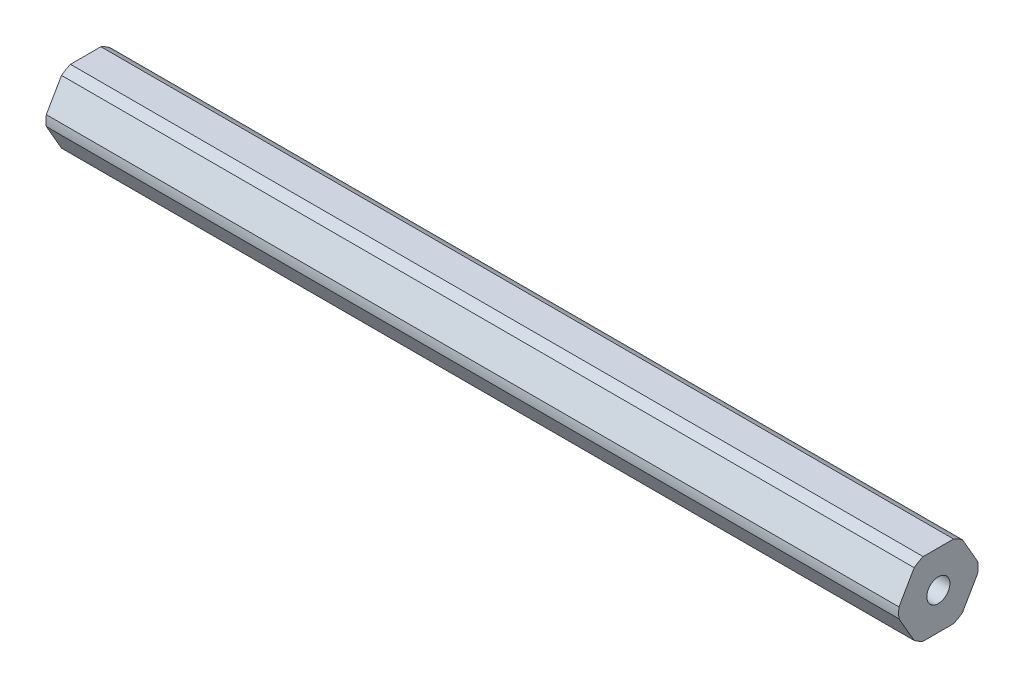
ISO-10303-21;
HEADER;
FILE_DESCRIPTION(('STEP AP214'),'2;1');
FILE_NAME('part.step','',(''),(''),'','','');
FILE_SCHEMA(('AUTOMOTIVE_DESIGN { 1 0 10303 214 1 1 1 1 }'));
ENDSEC;
DATA;
#1=APPLICATION_CONTEXT('core data for automotive mechanical design processes');
#2=APPLICATION_PROTOCOL_DEFINITION('international standard','automotive_design',2000,#1);
#3=PRODUCT_CONTEXT('',#1,'mechanical');
#4=PRODUCT('Part','Part','',(#3));
#5=PRODUCT_RELATED_PRODUCT_CATEGORY('part','',(#4));
#6=PRODUCT_DEFINITION_FORMATION('','',#4);
#7=PRODUCT_DEFINITION_CONTEXT('part definition',#1,'design');
#8=PRODUCT_DEFINITION('design','',#6,#7);
#9=PRODUCT_DEFINITION_SHAPE('','',#8);
#10=(LENGTH_UNIT() NAMED_UNIT(*) SI_UNIT(.MILLI.,.METRE.));
#11=(NAMED_UNIT(*) PLANE_ANGLE_UNIT() SI_UNIT($,.RADIAN.));
#12=(NAMED_UNIT(*) SI_UNIT($,.STERADIAN.) SOLID_ANGLE_UNIT());
#13=UNCERTAINTY_MEASURE_WITH_UNIT(LENGTH_MEASURE(1.E-05),#10,'distance_accuracy_value','');
#14=(GEOMETRIC_REPRESENTATION_CONTEXT(3) GLOBAL_UNCERTAINTY_ASSIGNED_CONTEXT((#13)) GLOBAL_UNIT_ASSIGNED_CONTEXT((#10,
#11,#12)) REPRESENTATION_CONTEXT('',''));
#15=CARTESIAN_POINT('',(0.,0.,0.));
#16=DIRECTION('',(0.,0.,1.));
#17=DIRECTION('',(1.,0.,0.));
#18=AXIS2_PLACEMENT_3D('',#15,#16,#17);
#19=CARTESIAN_POINT('',(73.81875,3.17499999999999,-5.49926131403116));
#20=DIRECTION('',(0.,-0.500000000000001,0.866025403784438));
#21=DIRECTION('',(0.,-0.866025403784438,-0.500000000000001));
#22=AXIS2_PLACEMENT_3D('',#19,#20,#21);
#23=PLANE('',#22);
#24=DIRECTION('',(0.,0.866025403784438,0.500000000000001));
#25=VECTOR('',#24,1.);
#26=CARTESIAN_POINT('',(-73.81875,3.17499999999999,-5.49926131403116));
#27=LINE('',#26,#25);
#28=CARTESIAN_POINT('',(-73.81875,0.89303957103212,-6.81675178197584));
#29=VERTEX_POINT('',#28);
#30=CARTESIAN_POINT('',(-73.81875,5.45696042896787,-4.18177084608648));
#31=VERTEX_POINT('',#30);
#32=EDGE_CURVE('E164',#29,#31,#27,.T.);
#33=ORIENTED_EDGE('',*,*,#32,.T.);
#34=DIRECTION('',(-1.,0.,0.));
#35=VECTOR('',#34,1.);
#36=CARTESIAN_POINT('',(73.81875,5.45696042896787,-4.18177084608648));
#37=LINE('',#36,#35);
#38=CARTESIAN_POINT('',(73.81875,5.45696042896787,-4.18177084608648));
#39=VERTEX_POINT('',#38);
#40=EDGE_CURVE('E11',#39,#31,#37,.T.);
#41=ORIENTED_EDGE('',*,*,#40,.F.);
#42=DIRECTION('',(0.,0.866025403784438,0.500000000000001));
#43=VECTOR('',#42,1.);
#44=CARTESIAN_POINT('',(73.81875,3.17499999999999,-5.49926131403116));
#45=LINE('',#44,#43);
#46=CARTESIAN_POINT('',(73.81875,0.89303957103212,-6.81675178197584));
#47=VERTEX_POINT('',#46);
#48=EDGE_CURVE('E223',#47,#39,#45,.T.);
#49=ORIENTED_EDGE('',*,*,#48,.F.);
#50=DIRECTION('',(-1.,0.,0.));
#51=VECTOR('',#50,1.);
#52=CARTESIAN_POINT('',(73.81875,0.89303957103212,-6.81675178197584));
#53=LINE('',#52,#51);
#54=EDGE_CURVE('E157',#47,#29,#53,.T.);
#55=ORIENTED_EDGE('',*,*,#54,.T.);
#56=EDGE_LOOP('',(#33,#41,#49,#55));
#57=FACE_BOUND('',#56,.T.);
#58=ADVANCED_FACE('F39',(#57),#23,.F.);
#59=CARTESIAN_POINT('',(73.81875,0.,0.));
#60=DIRECTION('',(-1.,0.,0.));
#61=DIRECTION('',(0.,0.,1.));
#62=AXIS2_PLACEMENT_3D('',#59,#60,#61);
#63=CYLINDRICAL_SURFACE('',#62,6.874999966);
#64=CARTESIAN_POINT('',(-73.81875,0.,0.));
#65=DIRECTION('',(1.,0.,0.));
#66=DIRECTION('',(0.,0.,-1.));
#67=AXIS2_PLACEMENT_3D('',#64,#65,#66);
#68=CIRCLE('',#67,6.874999966);
#69=CARTESIAN_POINT('',(-73.81875,6.34999999999998,-2.63498093588933));
#70=VERTEX_POINT('',#69);
#71=EDGE_CURVE('E167',#31,#70,#68,.T.);
#72=ORIENTED_EDGE('',*,*,#71,.T.);
#73=DIRECTION('',(-1.,0.,0.));
#74=VECTOR('',#73,1.);
#75=CARTESIAN_POINT('',(73.81875,6.34999999999998,-2.63498093588933));
#76=LINE('',#75,#74);
#77=CARTESIAN_POINT('',(73.81875,6.34999999999998,-2.63498093588933));
#78=VERTEX_POINT('',#77);
#79=EDGE_CURVE('E48',#78,#70,#76,.T.);
#80=ORIENTED_EDGE('',*,*,#79,.F.);
#81=CARTESIAN_POINT('',(73.81875,0.,0.));
#82=DIRECTION('',(1.,0.,0.));
#83=DIRECTION('',(0.,0.,-1.));
#84=AXIS2_PLACEMENT_3D('',#81,#82,#83);
#85=CIRCLE('',#84,6.874999966);
#86=EDGE_CURVE('E111',#39,#78,#85,.T.);
#87=ORIENTED_EDGE('',*,*,#86,.F.);
#88=ORIENTED_EDGE('',*,*,#40,.T.);
#89=EDGE_LOOP('',(#72,#80,#87,#88));
#90=FACE_BOUND('',#89,.T.);
#91=ADVANCED_FACE('F258',(#90),#63,.T.);
#92=CARTESIAN_POINT('',(73.81875,6.34999999999997,0.));
#93=DIRECTION('',(0.,-1.,0.));
#94=DIRECTION('',(0.,0.,-1.));
#95=AXIS2_PLACEMENT_3D('',#92,#93,#94);
#96=PLANE('',#95);
#97=DIRECTION('',(0.,0.,1.));
#98=VECTOR('',#97,1.);
#99=CARTESIAN_POINT('',(-73.81875,6.34999999999997,0.));
#100=LINE('',#99,#98);
#101=CARTESIAN_POINT('',(-73.81875,6.34999999999997,2.63498093588938));
#102=VERTEX_POINT('',#101);
#103=EDGE_CURVE('E169',#70,#102,#100,.T.);
#104=ORIENTED_EDGE('',*,*,#103,.T.);
#105=DIRECTION('',(-1.,0.,0.));
#106=VECTOR('',#105,1.);
#107=CARTESIAN_POINT('',(73.81875,6.34999999999997,2.63498093588938));
#108=LINE('',#107,#106);
#109=CARTESIAN_POINT('',(73.81875,6.34999999999997,2.63498093588938));
#110=VERTEX_POINT('',#109);
#111=EDGE_CURVE('E199',#110,#102,#108,.T.);
#112=ORIENTED_EDGE('',*,*,#111,.F.);
#113=DIRECTION('',(0.,0.,1.));
#114=VECTOR('',#113,1.);
#115=CARTESIAN_POINT('',(73.81875,6.34999999999997,0.));
#116=LINE('',#115,#114);
#117=EDGE_CURVE('E207',#78,#110,#116,.T.);
#118=ORIENTED_EDGE('',*,*,#117,.F.);
#119=ORIENTED_EDGE('',*,*,#79,.T.);
#120=EDGE_LOOP('',(#104,#112,#118,#119));
#121=FACE_BOUND('',#120,.T.);
#122=ADVANCED_FACE('F205',(#121),#96,.F.);
#123=CARTESIAN_POINT('',(-73.81875,5.45696042896784,4.18177084608651));
#124=VERTEX_POINT('',#123);
#125=EDGE_CURVE('E170',#102,#124,#68,.T.);
#126=ORIENTED_EDGE('',*,*,#125,.T.);
#127=DIRECTION('',(-1.,0.,0.));
#128=VECTOR('',#127,1.);
#129=CARTESIAN_POINT('',(73.81875,5.45696042896784,4.18177084608651));
#130=LINE('',#129,#128);
#131=CARTESIAN_POINT('',(73.81875,5.45696042896784,4.18177084608651));
#132=VERTEX_POINT('',#131);
#133=EDGE_CURVE('E196',#132,#124,#130,.T.);
#134=ORIENTED_EDGE('',*,*,#133,.F.);
#135=EDGE_CURVE('E229',#110,#132,#85,.T.);
#136=ORIENTED_EDGE('',*,*,#135,.F.);
#137=ORIENTED_EDGE('',*,*,#111,.T.);
#138=EDGE_LOOP('',(#126,#134,#136,#137));
#139=FACE_BOUND('',#138,.T.);
#140=ADVANCED_FACE('F240',(#139),#63,.T.);
#141=CARTESIAN_POINT('',(73.81875,3.17499999999995,5.49926131403118));
#142=DIRECTION('',(0.,-0.499999999999995,-0.866025403784442));
#143=DIRECTION('',(0.,0.866025403784442,-0.499999999999995));
#144=AXIS2_PLACEMENT_3D('',#141,#142,#143);
#145=PLANE('',#144);
#146=DIRECTION('',(0.,-0.866025403784442,0.499999999999995));
#147=VECTOR('',#146,1.);
#148=CARTESIAN_POINT('',(-73.81875,3.17499999999995,5.49926131403118));
#149=LINE('',#148,#147);
#150=CARTESIAN_POINT('',(-73.81875,0.893039571032066,6.81675178197585));
#151=VERTEX_POINT('',#150);
#152=EDGE_CURVE('E172',#124,#151,#149,.T.);
#153=ORIENTED_EDGE('',*,*,#152,.T.);
#154=DIRECTION('',(-1.,0.,0.));
#155=VECTOR('',#154,1.);
#156=CARTESIAN_POINT('',(73.81875,0.893039571032066,6.81675178197585));
#157=LINE('',#156,#155);
#158=CARTESIAN_POINT('',(73.81875,0.893039571032066,6.81675178197585));
#159=VERTEX_POINT('',#158);
#160=EDGE_CURVE('E193',#159,#151,#157,.T.);
#161=ORIENTED_EDGE('',*,*,#160,.F.);
#162=DIRECTION('',(0.,-0.866025403784442,0.499999999999995));
#163=VECTOR('',#162,1.);
#164=CARTESIAN_POINT('',(73.81875,3.17499999999995,5.49926131403118));
#165=LINE('',#164,#163);
#166=EDGE_CURVE('E231',#132,#159,#165,.T.);
#167=ORIENTED_EDGE('',*,*,#166,.F.);
#168=ORIENTED_EDGE('',*,*,#133,.T.);
#169=EDGE_LOOP('',(#153,#161,#167,#168));
#170=FACE_BOUND('',#169,.T.);
#171=ADVANCED_FACE('F242',(#170),#145,.F.);
#172=CARTESIAN_POINT('',(-73.81875,-0.893039571032163,6.81675178197583));
#173=VERTEX_POINT('',#172);
#174=EDGE_CURVE('E174',#151,#173,#68,.T.);
#175=ORIENTED_EDGE('',*,*,#174,.T.);
#176=DIRECTION('',(-1.,0.,0.));
#177=VECTOR('',#176,1.);
#178=CARTESIAN_POINT('',(73.81875,-0.893039571032163,6.81675178197583));
#179=LINE('',#178,#177);
#180=CARTESIAN_POINT('',(73.81875,-0.893039571032163,6.81675178197583));
#181=VERTEX_POINT('',#180);
#182=EDGE_CURVE('E190',#181,#173,#179,.T.);
#183=ORIENTED_EDGE('',*,*,#182,.F.);
#184=EDGE_CURVE('E232',#159,#181,#85,.T.);
#185=ORIENTED_EDGE('',*,*,#184,.F.);
#186=ORIENTED_EDGE('',*,*,#160,.T.);
#187=EDGE_LOOP('',(#175,#183,#185,#186));
#188=FACE_BOUND('',#187,.T.);
#189=ADVANCED_FACE('F243',(#188),#63,.T.);
#190=CARTESIAN_POINT('',(73.81875,-3.17500000000003,5.49926131403114));
#191=DIRECTION('',(0.,0.500000000000007,-0.866025403784435));
#192=DIRECTION('',(0.,0.866025403784435,0.500000000000007));
#193=AXIS2_PLACEMENT_3D('',#190,#191,#192);
#194=PLANE('',#193);
#195=DIRECTION('',(0.,-0.866025403784435,-0.500000000000007));
#196=VECTOR('',#195,1.);
#197=CARTESIAN_POINT('',(-73.81875,-3.17500000000003,5.49926131403114));
#198=LINE('',#197,#196);
#199=CARTESIAN_POINT('',(-73.81875,-5.4569604289679,4.18177084608644));
#200=VERTEX_POINT('',#199);
#201=EDGE_CURVE('E175',#173,#200,#198,.T.);
#202=ORIENTED_EDGE('',*,*,#201,.T.);
#203=DIRECTION('',(-1.,0.,0.));
#204=VECTOR('',#203,1.);
#205=CARTESIAN_POINT('',(73.81875,-5.4569604289679,4.18177084608644));
#206=LINE('',#205,#204);
#207=CARTESIAN_POINT('',(73.81875,-5.4569604289679,4.18177084608644));
#208=VERTEX_POINT('',#207);
#209=EDGE_CURVE('E187',#208,#200,#206,.T.);
#210=ORIENTED_EDGE('',*,*,#209,.F.);
#211=DIRECTION('',(0.,-0.866025403784435,-0.500000000000007));
#212=VECTOR('',#211,1.);
#213=CARTESIAN_POINT('',(73.81875,-3.17500000000003,5.49926131403114));
#214=LINE('',#213,#212);
#215=EDGE_CURVE('E233',#181,#208,#214,.T.);
#216=ORIENTED_EDGE('',*,*,#215,.F.);
#217=ORIENTED_EDGE('',*,*,#182,.T.);
#218=EDGE_LOOP('',(#202,#210,#216,#217));
#219=FACE_BOUND('',#218,.T.);
#220=ADVANCED_FACE('F246',(#219),#194,.F.);
#221=CARTESIAN_POINT('',(-73.81875,-6.35,2.63498093588929));
#222=VERTEX_POINT('',#221);
#223=EDGE_CURVE('E177',#200,#222,#68,.T.);
#224=ORIENTED_EDGE('',*,*,#223,.T.);
#225=DIRECTION('',(-1.,0.,0.));
#226=VECTOR('',#225,1.);
#227=CARTESIAN_POINT('',(73.81875,-6.35,2.63498093588929));
#228=LINE('',#227,#226);
#229=CARTESIAN_POINT('',(73.81875,-6.35,2.63498093588929));
#230=VERTEX_POINT('',#229);
#231=EDGE_CURVE('E184',#230,#222,#228,.T.);
#232=ORIENTED_EDGE('',*,*,#231,.F.);
#233=EDGE_CURVE('E147',#208,#230,#85,.T.);
#234=ORIENTED_EDGE('',*,*,#233,.F.);
#235=ORIENTED_EDGE('',*,*,#209,.T.);
#236=EDGE_LOOP('',(#224,#232,#234,#235));
#237=FACE_BOUND('',#236,.T.);
#238=ADVANCED_FACE('F248',(#237),#63,.T.);
#239=CARTESIAN_POINT('',(73.81875,-6.34999999999997,0.));
#240=DIRECTION('',(0.,1.,0.));
#241=DIRECTION('',(0.,0.,1.));
#242=AXIS2_PLACEMENT_3D('',#239,#240,#241);
#243=PLANE('',#242);
#244=DIRECTION('',(0.,0.,-1.));
#245=VECTOR('',#244,1.);
#246=CARTESIAN_POINT('',(-73.81875,-6.34999999999997,0.));
#247=LINE('',#246,#245);
#248=CARTESIAN_POINT('',(-73.81875,-6.34999999999994,-2.63498093588942));
#249=VERTEX_POINT('',#248);
#250=EDGE_CURVE('E178',#222,#249,#247,.T.);
#251=ORIENTED_EDGE('',*,*,#250,.T.);
#252=DIRECTION('',(-1.,0.,0.));
#253=VECTOR('',#252,1.);
#254=CARTESIAN_POINT('',(73.81875,-6.34999999999994,-2.63498093588942));
#255=LINE('',#254,#253);
#256=CARTESIAN_POINT('',(73.81875,-6.34999999999994,-2.63498093588942));
#257=VERTEX_POINT('',#256);
#258=EDGE_CURVE('E152',#257,#249,#255,.T.);
#259=ORIENTED_EDGE('',*,*,#258,.F.);
#260=DIRECTION('',(0.,0.,-1.));
#261=VECTOR('',#260,1.);
#262=CARTESIAN_POINT('',(73.81875,-6.34999999999997,0.));
#263=LINE('',#262,#261);
#264=EDGE_CURVE('E142',#230,#257,#263,.T.);
#265=ORIENTED_EDGE('',*,*,#264,.F.);
#266=ORIENTED_EDGE('',*,*,#231,.T.);
#267=EDGE_LOOP('',(#251,#259,#265,#266));
#268=FACE_BOUND('',#267,.T.);
#269=ADVANCED_FACE('F251',(#268),#243,.F.);
#270=CARTESIAN_POINT('',(-73.81875,-5.4569604289678,-4.18177084608657));
#271=VERTEX_POINT('',#270);
#272=EDGE_CURVE('E151',#249,#271,#68,.T.);
#273=ORIENTED_EDGE('',*,*,#272,.T.);
#274=DIRECTION('',(-1.,0.,0.));
#275=VECTOR('',#274,1.);
#276=CARTESIAN_POINT('',(73.81875,-5.4569604289678,-4.18177084608657));
#277=LINE('',#276,#275);
#278=CARTESIAN_POINT('',(73.81875,-5.4569604289678,-4.18177084608657));
#279=VERTEX_POINT('',#278);
#280=EDGE_CURVE('E148',#279,#271,#277,.T.);
#281=ORIENTED_EDGE('',*,*,#280,.F.);
#282=EDGE_CURVE('E136',#257,#279,#85,.T.);
#283=ORIENTED_EDGE('',*,*,#282,.F.);
#284=ORIENTED_EDGE('',*,*,#258,.T.);
#285=EDGE_LOOP('',(#273,#281,#283,#284));
#286=FACE_BOUND('',#285,.T.);
#287=ADVANCED_FACE('F149',(#286),#63,.T.);
#288=CARTESIAN_POINT('',(73.81875,-3.17499999999997,-5.4992613140312));
#289=DIRECTION('',(0.,0.499999999999995,0.866025403784441));
#290=DIRECTION('',(0.,-0.866025403784441,0.499999999999995));
#291=AXIS2_PLACEMENT_3D('',#288,#289,#290);
#292=PLANE('',#291);
#293=DIRECTION('',(0.,0.866025403784441,-0.499999999999995));
#294=VECTOR('',#293,1.);
#295=CARTESIAN_POINT('',(-73.81875,-3.17499999999997,-5.4992613140312));
#296=LINE('',#295,#294);
#297=CARTESIAN_POINT('',(-73.81875,-0.893039571032135,-6.81675178197584));
#298=VERTEX_POINT('',#297);
#299=EDGE_CURVE('E97',#271,#298,#296,.T.);
#300=ORIENTED_EDGE('',*,*,#299,.T.);
#301=DIRECTION('',(-1.,0.,0.));
#302=VECTOR('',#301,1.);
#303=CARTESIAN_POINT('',(73.81875,-0.893039571032135,-6.81675178197584));
#304=LINE('',#303,#302);
#305=CARTESIAN_POINT('',(73.81875,-0.893039571032135,-6.81675178197584));
#306=VERTEX_POINT('',#305);
#307=EDGE_CURVE('E153',#306,#298,#304,.T.);
#308=ORIENTED_EDGE('',*,*,#307,.F.);
#309=DIRECTION('',(0.,0.866025403784441,-0.499999999999995));
#310=VECTOR('',#309,1.);
#311=CARTESIAN_POINT('',(73.81875,-3.17499999999997,-5.4992613140312));
#312=LINE('',#311,#310);
#313=EDGE_CURVE('E140',#279,#306,#312,.T.);
#314=ORIENTED_EDGE('',*,*,#313,.F.);
#315=ORIENTED_EDGE('',*,*,#280,.T.);
#316=EDGE_LOOP('',(#300,#308,#314,#315));
#317=FACE_BOUND('',#316,.T.);
#318=ADVANCED_FACE('F155',(#317),#292,.F.);
#319=CARTESIAN_POINT('',(73.81875,0.,0.));
#320=DIRECTION('',(-1.,0.,0.));
#321=DIRECTION('',(0.,0.,1.));
#322=AXIS2_PLACEMENT_3D('',#319,#320,#321);
#323=CYLINDRICAL_SURFACE('',#322,2.000000064);
#324=CARTESIAN_POINT('',(73.81875,0.,0.));
#325=DIRECTION('',(1.,0.,0.));
#326=DIRECTION('',(0.,0.,-1.));
#327=AXIS2_PLACEMENT_3D('',#324,#325,#326);
#328=CIRCLE('',#327,2.000000064);
#329=CARTESIAN_POINT('',(73.81875,0.,-2.000000064));
#330=VERTEX_POINT('',#329);
#331=EDGE_CURVE('E221',#330,#330,#328,.T.);
#332=ORIENTED_EDGE('',*,*,#331,.T.);
#333=EDGE_LOOP('',(#332));
#334=FACE_BOUND('',#333,.T.);
#335=CARTESIAN_POINT('',(-73.81875,0.,0.));
#336=DIRECTION('',(1.,0.,0.));
#337=DIRECTION('',(0.,0.,-1.));
#338=AXIS2_PLACEMENT_3D('',#335,#336,#337);
#339=CIRCLE('',#338,2.000000064);
#340=CARTESIAN_POINT('',(-73.81875,0.,-2.000000064));
#341=VERTEX_POINT('',#340);
#342=EDGE_CURVE('E161',#341,#341,#339,.T.);
#343=ORIENTED_EDGE('',*,*,#342,.F.);
#344=EDGE_LOOP('',(#343));
#345=FACE_BOUND('',#344,.T.);
#346=ADVANCED_FACE('F41',(#334,#345),#323,.F.);
#347=EDGE_CURVE('E103',#298,#29,#68,.T.);
#348=ORIENTED_EDGE('',*,*,#347,.T.);
#349=ORIENTED_EDGE('',*,*,#54,.F.);
#350=EDGE_CURVE('E56',#306,#47,#85,.T.);
#351=ORIENTED_EDGE('',*,*,#350,.F.);
#352=ORIENTED_EDGE('',*,*,#307,.T.);
#353=EDGE_LOOP('',(#348,#349,#351,#352));
#354=FACE_BOUND('',#353,.T.);
#355=ADVANCED_FACE('F255',(#354),#63,.T.);
#356=CARTESIAN_POINT('',(73.81875,0.,0.));
#357=DIRECTION('',(1.,0.,0.));
#358=DIRECTION('',(0.,0.,-1.));
#359=AXIS2_PLACEMENT_3D('',#356,#357,#358);
#360=PLANE('',#359);
#361=ORIENTED_EDGE('',*,*,#331,.F.);
#362=EDGE_LOOP('',(#361));
#363=FACE_BOUND('',#362,.T.);
#364=ORIENTED_EDGE('',*,*,#48,.T.);
#365=ORIENTED_EDGE('',*,*,#86,.T.);
#366=ORIENTED_EDGE('',*,*,#117,.T.);
#367=ORIENTED_EDGE('',*,*,#135,.T.);
#368=ORIENTED_EDGE('',*,*,#166,.T.);
#369=ORIENTED_EDGE('',*,*,#184,.T.);
#370=ORIENTED_EDGE('',*,*,#215,.T.);
#371=ORIENTED_EDGE('',*,*,#233,.T.);
#372=ORIENTED_EDGE('',*,*,#264,.T.);
#373=ORIENTED_EDGE('',*,*,#282,.T.);
#374=ORIENTED_EDGE('',*,*,#313,.T.);
#375=ORIENTED_EDGE('',*,*,#350,.T.);
#376=EDGE_LOOP('',(#364,#365,#366,#367,#368,#369,#370,#371,#372,#373,#374,#375));
#377=FACE_BOUND('',#376,.T.);
#378=ADVANCED_FACE('F138',(#363,#377),#360,.T.);
#379=CARTESIAN_POINT('',(-73.81875,0.,0.));
#380=DIRECTION('',(1.,0.,0.));
#381=DIRECTION('',(0.,0.,-1.));
#382=AXIS2_PLACEMENT_3D('',#379,#380,#381);
#383=PLANE('',#382);
#384=ORIENTED_EDGE('',*,*,#342,.T.);
#385=EDGE_LOOP('',(#384));
#386=FACE_BOUND('',#385,.T.);
#387=ORIENTED_EDGE('',*,*,#32,.F.);
#388=ORIENTED_EDGE('',*,*,#347,.F.);
#389=ORIENTED_EDGE('',*,*,#299,.F.);
#390=ORIENTED_EDGE('',*,*,#272,.F.);
#391=ORIENTED_EDGE('',*,*,#250,.F.);
#392=ORIENTED_EDGE('',*,*,#223,.F.);
#393=ORIENTED_EDGE('',*,*,#201,.F.);
#394=ORIENTED_EDGE('',*,*,#174,.F.);
#395=ORIENTED_EDGE('',*,*,#152,.F.);
#396=ORIENTED_EDGE('',*,*,#125,.F.);
#397=ORIENTED_EDGE('',*,*,#103,.F.);
#398=ORIENTED_EDGE('',*,*,#71,.F.);
#399=EDGE_LOOP('',(#387,#388,#389,#390,#391,#392,#393,#394,#395,#396,#397,#398));
#400=FACE_BOUND('',#399,.T.);
#401=ADVANCED_FACE('F211',(#386,#400),#383,.F.);
#402=CLOSED_SHELL('',(#58,#91,#122,#140,#171,#189,#220,#238,#269,#287,#318,#346,#355,#378,#401));
#403=MANIFOLD_SOLID_BREP('B2',#402);
#404=ADVANCED_BREP_SHAPE_REPRESENTATION('',(#18,#403),#14);
#405=SHAPE_DEFINITION_REPRESENTATION(#9,#404);
ENDSEC;
END-ISO-10303-21;
